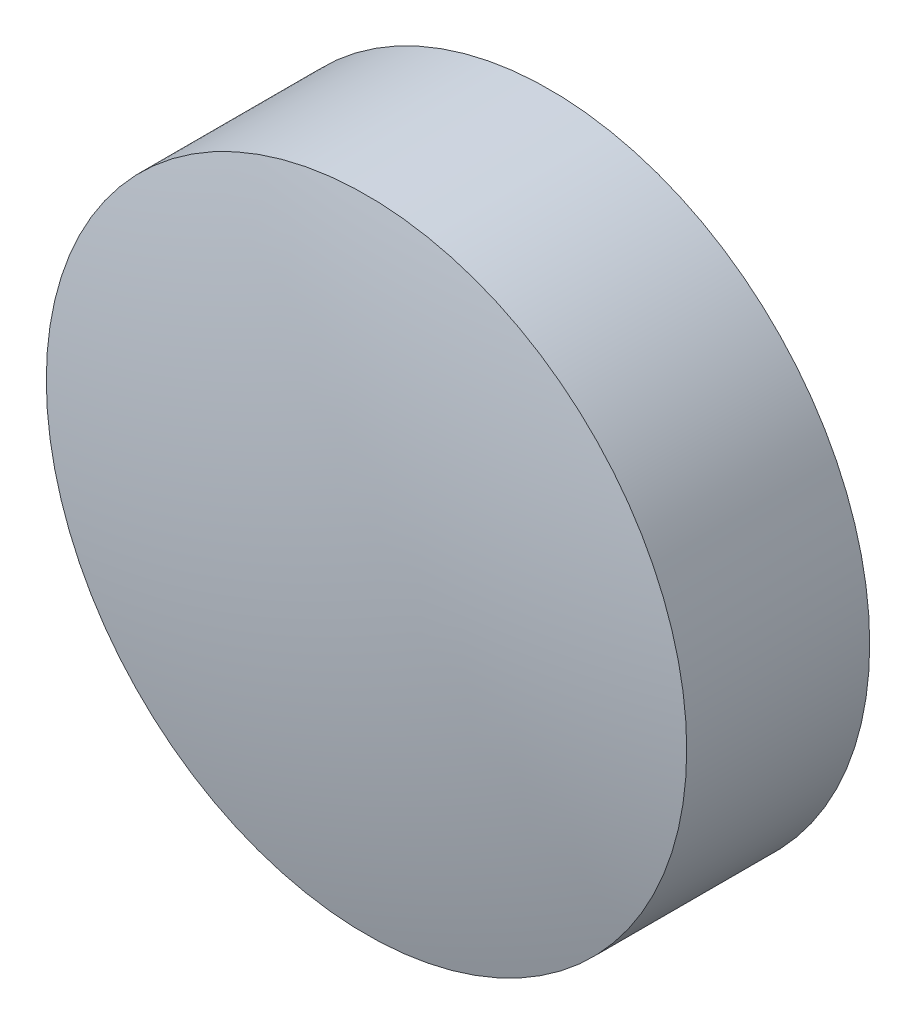
ISO-10303-21;
HEADER;
FILE_DESCRIPTION(('STEP AP214'),'2;1');
FILE_NAME('part.step','',(''),(''),'','','');
FILE_SCHEMA(('AUTOMOTIVE_DESIGN { 1 0 10303 214 1 1 1 1 }'));
ENDSEC;
DATA;
#1=APPLICATION_CONTEXT('core data for automotive mechanical design processes');
#2=APPLICATION_PROTOCOL_DEFINITION('international standard','automotive_design',2000,#1);
#3=PRODUCT_CONTEXT('',#1,'mechanical');
#4=PRODUCT('Part','Part','',(#3));
#5=PRODUCT_RELATED_PRODUCT_CATEGORY('part','',(#4));
#6=PRODUCT_DEFINITION_FORMATION('','',#4);
#7=PRODUCT_DEFINITION_CONTEXT('part definition',#1,'design');
#8=PRODUCT_DEFINITION('design','',#6,#7);
#9=PRODUCT_DEFINITION_SHAPE('','',#8);
#10=(LENGTH_UNIT() NAMED_UNIT(*) SI_UNIT(.MILLI.,.METRE.));
#11=(NAMED_UNIT(*) PLANE_ANGLE_UNIT() SI_UNIT($,.RADIAN.));
#12=(NAMED_UNIT(*) SI_UNIT($,.STERADIAN.) SOLID_ANGLE_UNIT());
#13=UNCERTAINTY_MEASURE_WITH_UNIT(LENGTH_MEASURE(1.E-05),#10,'distance_accuracy_value','');
#14=(GEOMETRIC_REPRESENTATION_CONTEXT(3) GLOBAL_UNCERTAINTY_ASSIGNED_CONTEXT((#13)) GLOBAL_UNIT_ASSIGNED_CONTEXT((#10,
#11,#12)) REPRESENTATION_CONTEXT('',''));
#15=CARTESIAN_POINT('',(0.,0.,0.));
#16=DIRECTION('',(0.,0.,1.));
#17=DIRECTION('',(1.,0.,0.));
#18=AXIS2_PLACEMENT_3D('',#15,#16,#17);
#19=CARTESIAN_POINT('',(-21.7679908457877,11.287620261908,-2.29731212887826));
#20=DIRECTION('',(0.308501008169562,0.801213275234325,0.512722552211866));
#21=DIRECTION('',(-0.930135712809475,0.366957452049821,-0.0137762165166534));
#22=AXIS2_PLACEMENT_3D('',#19,#20,#21);
#23=SPHERICAL_SURFACE('',#22,38.7812500000001);
#24=CARTESIAN_POINT('',(-21.7679908457876,11.287620261908,35.4839378711218));
#25=DIRECTION('',(0.,0.,1.));
#26=DIRECTION('',(1.,0.,0.));
#27=AXIS2_PLACEMENT_3D('',#24,#25,#26);
#28=CIRCLE('',#27,8.75);
#29=CARTESIAN_POINT('',(-13.0179908457876,11.287620261908,35.4839378711217));
#30=VERTEX_POINT('',#29);
#31=EDGE_CURVE('E19',#30,#30,#28,.F.);
#32=ORIENTED_EDGE('',*,*,#31,.F.);
#33=EDGE_LOOP('',(#32));
#34=FACE_BOUND('',#33,.T.);
#35=ADVANCED_FACE('F15',(#34),#23,.T.);
#36=CARTESIAN_POINT('',(-21.7679908457876,11.287620261908,30.4839378711218));
#37=DIRECTION('',(0.,0.,1.));
#38=DIRECTION('',(1.,0.,0.));
#39=AXIS2_PLACEMENT_3D('',#36,#37,#38);
#40=CYLINDRICAL_SURFACE('',#39,8.75);
#41=ORIENTED_EDGE('',*,*,#31,.T.);
#42=EDGE_LOOP('',(#41));
#43=FACE_BOUND('',#42,.T.);
#44=CARTESIAN_POINT('',(-21.7679908457876,11.287620261908,30.4839378711218));
#45=DIRECTION('',(0.,0.,1.));
#46=DIRECTION('',(1.,0.,0.));
#47=AXIS2_PLACEMENT_3D('',#44,#45,#46);
#48=CIRCLE('',#47,8.75);
#49=CARTESIAN_POINT('',(-13.0179908457876,11.287620261908,30.4839378711217));
#50=VERTEX_POINT('',#49);
#51=EDGE_CURVE('E10',#50,#50,#48,.F.);
#52=ORIENTED_EDGE('',*,*,#51,.F.);
#53=EDGE_LOOP('',(#52));
#54=FACE_BOUND('',#53,.T.);
#55=ADVANCED_FACE('F29',(#43,#54),#40,.T.);
#56=CARTESIAN_POINT('',(-21.7679908457876,11.287620261908,30.4839378711218));
#57=DIRECTION('',(0.,0.,-1.));
#58=DIRECTION('',(-1.,0.,0.));
#59=AXIS2_PLACEMENT_3D('',#56,#57,#58);
#60=PLANE('',#59);
#61=ORIENTED_EDGE('',*,*,#51,.T.);
#62=EDGE_LOOP('',(#61));
#63=FACE_BOUND('',#62,.T.);
#64=ADVANCED_FACE('F37',(#63),#60,.T.);
#65=CLOSED_SHELL('',(#35,#55,#64));
#66=MANIFOLD_SOLID_BREP('B1',#65);
#67=ADVANCED_BREP_SHAPE_REPRESENTATION('',(#18,#66),#14);
#68=SHAPE_DEFINITION_REPRESENTATION(#9,#67);
ENDSEC;
END-ISO-10303-21;
